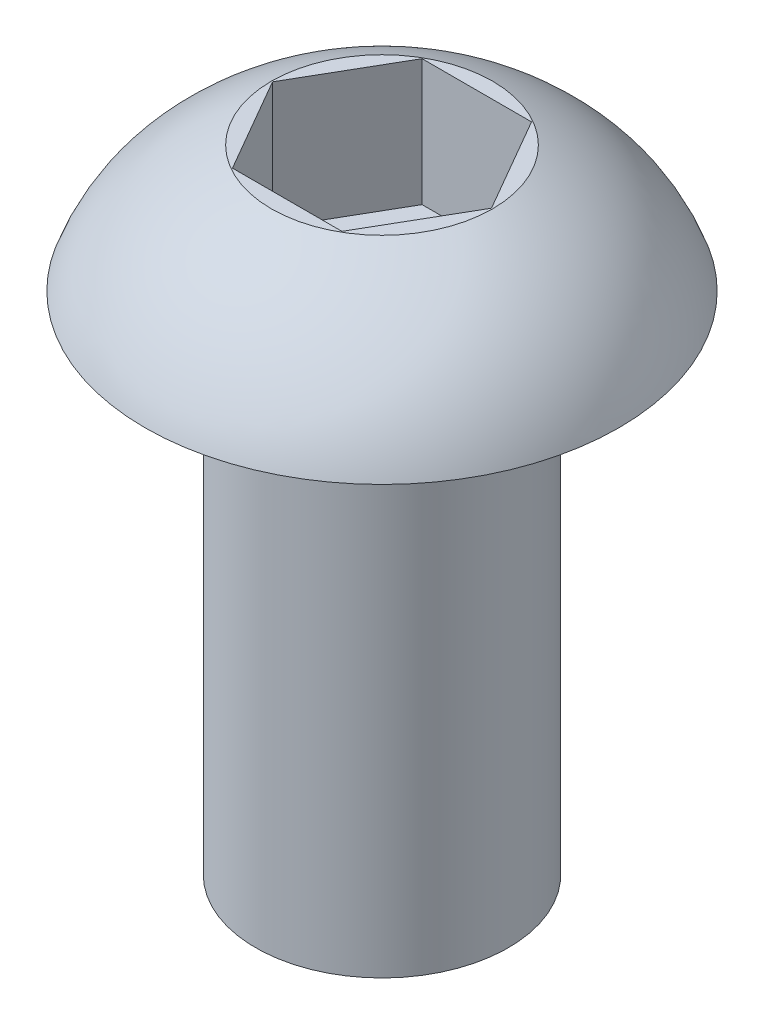
ISO-10303-21;
HEADER;
FILE_DESCRIPTION(('STEP AP214'),'2;1');
FILE_NAME('part.step','',(''),(''),'','','');
FILE_SCHEMA(('AUTOMOTIVE_DESIGN { 1 0 10303 214 1 1 1 1 }'));
ENDSEC;
DATA;
#1=APPLICATION_CONTEXT('core data for automotive mechanical design processes');
#2=APPLICATION_PROTOCOL_DEFINITION('international standard','automotive_design',2000,#1);
#3=PRODUCT_CONTEXT('',#1,'mechanical');
#4=PRODUCT('Part','Part','',(#3));
#5=PRODUCT_RELATED_PRODUCT_CATEGORY('part','',(#4));
#6=PRODUCT_DEFINITION_FORMATION('','',#4);
#7=PRODUCT_DEFINITION_CONTEXT('part definition',#1,'design');
#8=PRODUCT_DEFINITION('design','',#6,#7);
#9=PRODUCT_DEFINITION_SHAPE('','',#8);
#10=(LENGTH_UNIT() NAMED_UNIT(*) SI_UNIT(.MILLI.,.METRE.));
#11=(NAMED_UNIT(*) PLANE_ANGLE_UNIT() SI_UNIT($,.RADIAN.));
#12=(NAMED_UNIT(*) SI_UNIT($,.STERADIAN.) SOLID_ANGLE_UNIT());
#13=UNCERTAINTY_MEASURE_WITH_UNIT(LENGTH_MEASURE(1.E-05),#10,'distance_accuracy_value','');
#14=(GEOMETRIC_REPRESENTATION_CONTEXT(3) GLOBAL_UNCERTAINTY_ASSIGNED_CONTEXT((#13)) GLOBAL_UNIT_ASSIGNED_CONTEXT((#10,
#11,#12)) REPRESENTATION_CONTEXT('',''));
#15=CARTESIAN_POINT('',(0.,0.,0.));
#16=DIRECTION('',(0.,0.,1.));
#17=DIRECTION('',(1.,0.,0.));
#18=AXIS2_PLACEMENT_3D('',#15,#16,#17);
#19=CARTESIAN_POINT('',(0.,-4.,0.999999999999999));
#20=DIRECTION('',(0.,-1.,0.));
#21=DIRECTION('',(0.,0.,-1.));
#22=AXIS2_PLACEMENT_3D('',#19,#20,#21);
#23=CYLINDRICAL_SURFACE('',#22,2.);
#24=CARTESIAN_POINT('',(0.,-4.,0.999999999999999));
#25=DIRECTION('',(0.,-1.,0.));
#26=DIRECTION('',(0.,0.,-1.));
#27=AXIS2_PLACEMENT_3D('',#24,#25,#26);
#28=CIRCLE('',#27,2.);
#29=CARTESIAN_POINT('',(0.,-4.,-1.));
#30=VERTEX_POINT('',#29);
#31=EDGE_CURVE('E167',#30,#30,#28,.T.);
#32=ORIENTED_EDGE('',*,*,#31,.F.);
#33=EDGE_LOOP('',(#32));
#34=FACE_BOUND('',#33,.T.);
#35=CARTESIAN_POINT('',(0.,4.,1.));
#36=DIRECTION('',(0.,-1.,0.));
#37=DIRECTION('',(0.,0.,-1.));
#38=AXIS2_PLACEMENT_3D('',#35,#36,#37);
#39=CIRCLE('',#38,2.);
#40=CARTESIAN_POINT('',(0.,4.,-1.));
#41=VERTEX_POINT('',#40);
#42=EDGE_CURVE('E11',#41,#41,#39,.T.);
#43=ORIENTED_EDGE('',*,*,#42,.T.);
#44=EDGE_LOOP('',(#43));
#45=FACE_BOUND('',#44,.T.);
#46=ADVANCED_FACE('F41',(#34,#45),#23,.T.);
#47=CARTESIAN_POINT('',(0.,4.,0.));
#48=DIRECTION('',(0.,-1.,0.));
#49=DIRECTION('',(0.,0.,-1.));
#50=AXIS2_PLACEMENT_3D('',#47,#48,#49);
#51=PLANE('',#50);
#52=CARTESIAN_POINT('',(0.,4.,1.));
#53=DIRECTION('',(0.,-1.,0.));
#54=DIRECTION('',(0.,0.,-1.));
#55=AXIS2_PLACEMENT_3D('',#52,#53,#54);
#56=CIRCLE('',#55,3.75);
#57=CARTESIAN_POINT('',(0.,4.,-2.75));
#58=VERTEX_POINT('',#57);
#59=EDGE_CURVE('E49',#58,#58,#56,.T.);
#60=ORIENTED_EDGE('',*,*,#59,.T.);
#61=EDGE_LOOP('',(#60));
#62=FACE_BOUND('',#61,.T.);
#63=ORIENTED_EDGE('',*,*,#42,.F.);
#64=EDGE_LOOP('',(#63));
#65=FACE_BOUND('',#64,.T.);
#66=ADVANCED_FACE('F180',(#62,#65),#51,.T.);
#67=CARTESIAN_POINT('',(0.,6.,-0.750000000000001));
#68=CARTESIAN_POINT('',(0.,5.31957253408555,-2.29097588116488));
#69=CARTESIAN_POINT('',(0.,4.,-2.75));
#70=B_SPLINE_CURVE_WITH_KNOTS('',2,(#67,#68,#69),.UNSPECIFIED.,.F.,.F.,(3,3),(0.,
0.856055688663619),.UNSPECIFIED.);
#71=CARTESIAN_POINT('',(0.,-4.,0.999999999999999));
#72=DIRECTION('',(0.,-1.,0.));
#73=AXIS1_PLACEMENT('',#71,#72);
#74=SURFACE_OF_REVOLUTION('',#70,#73);
#75=ORIENTED_EDGE('',*,*,#59,.F.);
#76=EDGE_LOOP('',(#75));
#77=FACE_BOUND('',#76,.T.);
#78=CARTESIAN_POINT('',(0.,6.,1.));
#79=DIRECTION('',(0.,1.,0.));
#80=DIRECTION('',(0.,0.,1.));
#81=AXIS2_PLACEMENT_3D('',#78,#79,#80);
#82=CIRCLE('',#81,1.75);
#83=CARTESIAN_POINT('',(0.,6.,2.75));
#84=VERTEX_POINT('',#83);
#85=EDGE_CURVE('E111',#84,#84,#82,.T.);
#86=ORIENTED_EDGE('',*,*,#85,.F.);
#87=EDGE_LOOP('',(#86));
#88=FACE_BOUND('',#87,.T.);
#89=ADVANCED_FACE('F176',(#77,#88),#74,.T.);
#90=CARTESIAN_POINT('',(0.,-4.,0.));
#91=DIRECTION('',(0.,-1.,0.));
#92=DIRECTION('',(0.,0.,-1.));
#93=AXIS2_PLACEMENT_3D('',#90,#91,#92);
#94=PLANE('',#93);
#95=ORIENTED_EDGE('',*,*,#31,.T.);
#96=EDGE_LOOP('',(#95));
#97=FACE_BOUND('',#96,.T.);
#98=ADVANCED_FACE('F179',(#97),#94,.T.);
#99=CARTESIAN_POINT('',(0.,6.,1.));
#100=DIRECTION('',(0.,1.,0.));
#101=DIRECTION('',(0.,0.,1.));
#102=AXIS2_PLACEMENT_3D('',#99,#100,#101);
#103=PLANE('',#102);
#104=ORIENTED_EDGE('',*,*,#85,.T.);
#105=EDGE_LOOP('',(#104));
#106=FACE_BOUND('',#105,.T.);
#107=DIRECTION('',(-0.5,0.,-0.866025403784438));
#108=VECTOR('',#107,1.);
#109=CARTESIAN_POINT('',(1.73205080756888,6.,1.));
#110=LINE('',#109,#108);
#111=CARTESIAN_POINT('',(1.73205080756888,6.,1.));
#112=VERTEX_POINT('',#111);
#113=CARTESIAN_POINT('',(0.866025403784438,6.,-0.5));
#114=VERTEX_POINT('',#113);
#115=EDGE_CURVE('E102',#112,#114,#110,.T.);
#116=ORIENTED_EDGE('',*,*,#115,.F.);
#117=DIRECTION('',(0.5,0.,-0.866025403784439));
#118=VECTOR('',#117,1.);
#119=CARTESIAN_POINT('',(0.866025403784438,6.,2.5));
#120=LINE('',#119,#118);
#121=CARTESIAN_POINT('',(0.866025403784438,6.,2.5));
#122=VERTEX_POINT('',#121);
#123=EDGE_CURVE('E93',#122,#112,#120,.T.);
#124=ORIENTED_EDGE('',*,*,#123,.F.);
#125=DIRECTION('',(1.,0.,0.));
#126=VECTOR('',#125,1.);
#127=CARTESIAN_POINT('',(-0.866025403784439,6.,2.5));
#128=LINE('',#127,#126);
#129=CARTESIAN_POINT('',(-0.866025403784439,6.,2.5));
#130=VERTEX_POINT('',#129);
#131=EDGE_CURVE('E129',#130,#122,#128,.T.);
#132=ORIENTED_EDGE('',*,*,#131,.F.);
#133=DIRECTION('',(0.5,0.,0.866025403784439));
#134=VECTOR('',#133,1.);
#135=CARTESIAN_POINT('',(-1.73205080756888,6.,1.));
#136=LINE('',#135,#134);
#137=CARTESIAN_POINT('',(-1.73205080756888,6.,1.));
#138=VERTEX_POINT('',#137);
#139=EDGE_CURVE('E126',#138,#130,#136,.T.);
#140=ORIENTED_EDGE('',*,*,#139,.F.);
#141=DIRECTION('',(-0.5,0.,0.866025403784439));
#142=VECTOR('',#141,1.);
#143=CARTESIAN_POINT('',(-0.866025403784439,6.,-0.5));
#144=LINE('',#143,#142);
#145=CARTESIAN_POINT('',(-0.866025403784439,6.,-0.5));
#146=VERTEX_POINT('',#145);
#147=EDGE_CURVE('E121',#146,#138,#144,.T.);
#148=ORIENTED_EDGE('',*,*,#147,.F.);
#149=DIRECTION('',(-1.,0.,0.));
#150=VECTOR('',#149,1.);
#151=CARTESIAN_POINT('',(0.866025403784438,6.,-0.5));
#152=LINE('',#151,#150);
#153=EDGE_CURVE('E117',#114,#146,#152,.T.);
#154=ORIENTED_EDGE('',*,*,#153,.F.);
#155=EDGE_LOOP('',(#116,#124,#132,#140,#148,#154));
#156=FACE_BOUND('',#155,.T.);
#157=ADVANCED_FACE('F115',(#106,#156),#103,.T.);
#158=CARTESIAN_POINT('',(0.866025403784438,6.,2.5));
#159=DIRECTION('',(-0.866025403784439,0.,-0.5));
#160=DIRECTION('',(-0.5,0.,0.866025403784439));
#161=AXIS2_PLACEMENT_3D('',#158,#159,#160);
#162=PLANE('',#161);
#163=DIRECTION('',(0.5,0.,-0.866025403784439));
#164=VECTOR('',#163,1.);
#165=CARTESIAN_POINT('',(0.866025403784438,4.,2.5));
#166=LINE('',#165,#164);
#167=CARTESIAN_POINT('',(0.866025403784438,4.,2.5));
#168=VERTEX_POINT('',#167);
#169=CARTESIAN_POINT('',(1.73205080756888,4.,1.));
#170=VERTEX_POINT('',#169);
#171=EDGE_CURVE('E132',#168,#170,#166,.T.);
#172=ORIENTED_EDGE('',*,*,#171,.F.);
#173=DIRECTION('',(0.,-1.,0.));
#174=VECTOR('',#173,1.);
#175=CARTESIAN_POINT('',(0.866025403784438,6.,2.5));
#176=LINE('',#175,#174);
#177=EDGE_CURVE('E56',#122,#168,#176,.T.);
#178=ORIENTED_EDGE('',*,*,#177,.F.);
#179=ORIENTED_EDGE('',*,*,#123,.T.);
#180=DIRECTION('',(0.,-1.,0.));
#181=VECTOR('',#180,1.);
#182=CARTESIAN_POINT('',(1.73205080756888,6.,1.));
#183=LINE('',#182,#181);
#184=EDGE_CURVE('E96',#112,#170,#183,.T.);
#185=ORIENTED_EDGE('',*,*,#184,.T.);
#186=EDGE_LOOP('',(#172,#178,#179,#185));
#187=FACE_BOUND('',#186,.T.);
#188=ADVANCED_FACE('F95',(#187),#162,.T.);
#189=CARTESIAN_POINT('',(1.73205080756888,6.,1.));
#190=DIRECTION('',(-0.866025403784439,0.,0.5));
#191=DIRECTION('',(0.5,0.,0.866025403784438));
#192=AXIS2_PLACEMENT_3D('',#189,#190,#191);
#193=PLANE('',#192);
#194=DIRECTION('',(-0.5,0.,-0.866025403784438));
#195=VECTOR('',#194,1.);
#196=CARTESIAN_POINT('',(1.73205080756888,4.,1.));
#197=LINE('',#196,#195);
#198=CARTESIAN_POINT('',(0.866025403784438,4.,-0.5));
#199=VERTEX_POINT('',#198);
#200=EDGE_CURVE('E109',#170,#199,#197,.T.);
#201=ORIENTED_EDGE('',*,*,#200,.F.);
#202=ORIENTED_EDGE('',*,*,#184,.F.);
#203=ORIENTED_EDGE('',*,*,#115,.T.);
#204=DIRECTION('',(0.,-1.,0.));
#205=VECTOR('',#204,1.);
#206=CARTESIAN_POINT('',(0.866025403784438,6.,-0.5));
#207=LINE('',#206,#205);
#208=EDGE_CURVE('E112',#114,#199,#207,.T.);
#209=ORIENTED_EDGE('',*,*,#208,.T.);
#210=EDGE_LOOP('',(#201,#202,#203,#209));
#211=FACE_BOUND('',#210,.T.);
#212=ADVANCED_FACE('F106',(#211),#193,.T.);
#213=CARTESIAN_POINT('',(0.866025403784438,6.,-0.5));
#214=DIRECTION('',(0.,0.,1.));
#215=DIRECTION('',(1.,0.,0.));
#216=AXIS2_PLACEMENT_3D('',#213,#214,#215);
#217=PLANE('',#216);
#218=DIRECTION('',(-1.,0.,0.));
#219=VECTOR('',#218,1.);
#220=CARTESIAN_POINT('',(0.866025403784438,4.,-0.5));
#221=LINE('',#220,#219);
#222=CARTESIAN_POINT('',(-0.866025403784439,4.,-0.5));
#223=VERTEX_POINT('',#222);
#224=EDGE_CURVE('E137',#199,#223,#221,.T.);
#225=ORIENTED_EDGE('',*,*,#224,.F.);
#226=ORIENTED_EDGE('',*,*,#208,.F.);
#227=ORIENTED_EDGE('',*,*,#153,.T.);
#228=DIRECTION('',(0.,-1.,0.));
#229=VECTOR('',#228,1.);
#230=CARTESIAN_POINT('',(-0.866025403784439,6.,-0.5));
#231=LINE('',#230,#229);
#232=EDGE_CURVE('E159',#146,#223,#231,.T.);
#233=ORIENTED_EDGE('',*,*,#232,.T.);
#234=EDGE_LOOP('',(#225,#226,#227,#233));
#235=FACE_BOUND('',#234,.T.);
#236=ADVANCED_FACE('F211',(#235),#217,.T.);
#237=CARTESIAN_POINT('',(-0.866025403784439,6.,-0.5));
#238=DIRECTION('',(0.866025403784439,0.,0.5));
#239=DIRECTION('',(0.5,0.,-0.866025403784439));
#240=AXIS2_PLACEMENT_3D('',#237,#238,#239);
#241=PLANE('',#240);
#242=DIRECTION('',(-0.5,0.,0.866025403784439));
#243=VECTOR('',#242,1.);
#244=CARTESIAN_POINT('',(-0.866025403784439,4.,-0.5));
#245=LINE('',#244,#243);
#246=CARTESIAN_POINT('',(-1.73205080756888,4.,1.));
#247=VERTEX_POINT('',#246);
#248=EDGE_CURVE('E141',#223,#247,#245,.T.);
#249=ORIENTED_EDGE('',*,*,#248,.F.);
#250=ORIENTED_EDGE('',*,*,#232,.F.);
#251=ORIENTED_EDGE('',*,*,#147,.T.);
#252=DIRECTION('',(0.,-1.,0.));
#253=VECTOR('',#252,1.);
#254=CARTESIAN_POINT('',(-1.73205080756888,6.,1.));
#255=LINE('',#254,#253);
#256=EDGE_CURVE('E156',#138,#247,#255,.T.);
#257=ORIENTED_EDGE('',*,*,#256,.T.);
#258=EDGE_LOOP('',(#249,#250,#251,#257));
#259=FACE_BOUND('',#258,.T.);
#260=ADVANCED_FACE('F214',(#259),#241,.T.);
#261=CARTESIAN_POINT('',(-1.73205080756888,6.,1.));
#262=DIRECTION('',(0.866025403784439,0.,-0.5));
#263=DIRECTION('',(-0.5,0.,-0.866025403784439));
#264=AXIS2_PLACEMENT_3D('',#261,#262,#263);
#265=PLANE('',#264);
#266=DIRECTION('',(0.5,0.,0.866025403784439));
#267=VECTOR('',#266,1.);
#268=CARTESIAN_POINT('',(-1.73205080756888,4.,1.));
#269=LINE('',#268,#267);
#270=CARTESIAN_POINT('',(-0.866025403784439,4.,2.5));
#271=VERTEX_POINT('',#270);
#272=EDGE_CURVE('E145',#247,#271,#269,.T.);
#273=ORIENTED_EDGE('',*,*,#272,.F.);
#274=ORIENTED_EDGE('',*,*,#256,.F.);
#275=ORIENTED_EDGE('',*,*,#139,.T.);
#276=DIRECTION('',(0.,-1.,0.));
#277=VECTOR('',#276,1.);
#278=CARTESIAN_POINT('',(-0.866025403784439,6.,2.5));
#279=LINE('',#278,#277);
#280=EDGE_CURVE('E61',#130,#271,#279,.T.);
#281=ORIENTED_EDGE('',*,*,#280,.T.);
#282=EDGE_LOOP('',(#273,#274,#275,#281));
#283=FACE_BOUND('',#282,.T.);
#284=ADVANCED_FACE('F218',(#283),#265,.T.);
#285=CARTESIAN_POINT('',(-0.866025403784439,6.,2.5));
#286=DIRECTION('',(0.,0.,-1.));
#287=DIRECTION('',(-1.,0.,0.));
#288=AXIS2_PLACEMENT_3D('',#285,#286,#287);
#289=PLANE('',#288);
#290=DIRECTION('',(1.,0.,0.));
#291=VECTOR('',#290,1.);
#292=CARTESIAN_POINT('',(-0.866025403784439,4.,2.5));
#293=LINE('',#292,#291);
#294=EDGE_CURVE('E103',#271,#168,#293,.T.);
#295=ORIENTED_EDGE('',*,*,#294,.F.);
#296=ORIENTED_EDGE('',*,*,#280,.F.);
#297=ORIENTED_EDGE('',*,*,#131,.T.);
#298=ORIENTED_EDGE('',*,*,#177,.T.);
#299=EDGE_LOOP('',(#295,#296,#297,#298));
#300=FACE_BOUND('',#299,.T.);
#301=ADVANCED_FACE('F222',(#300),#289,.T.);
#302=CARTESIAN_POINT('',(0.,4.,0.));
#303=DIRECTION('',(0.,-1.,0.));
#304=DIRECTION('',(0.,0.,-1.));
#305=AXIS2_PLACEMENT_3D('',#302,#303,#304);
#306=PLANE('',#305);
#307=ORIENTED_EDGE('',*,*,#294,.T.);
#308=ORIENTED_EDGE('',*,*,#171,.T.);
#309=ORIENTED_EDGE('',*,*,#200,.T.);
#310=ORIENTED_EDGE('',*,*,#224,.T.);
#311=ORIENTED_EDGE('',*,*,#248,.T.);
#312=ORIENTED_EDGE('',*,*,#272,.T.);
#313=EDGE_LOOP('',(#307,#308,#309,#310,#311,#312));
#314=FACE_BOUND('',#313,.T.);
#315=ADVANCED_FACE('F182',(#314),#306,.F.);
#316=CLOSED_SHELL('',(#46,#66,#89,#98,#157,#188,#212,#236,#260,#284,#301,#315));
#317=MANIFOLD_SOLID_BREP('B2',#316);
#318=ADVANCED_BREP_SHAPE_REPRESENTATION('',(#18,#317),#14);
#319=SHAPE_DEFINITION_REPRESENTATION(#9,#318);
ENDSEC;
END-ISO-10303-21;
